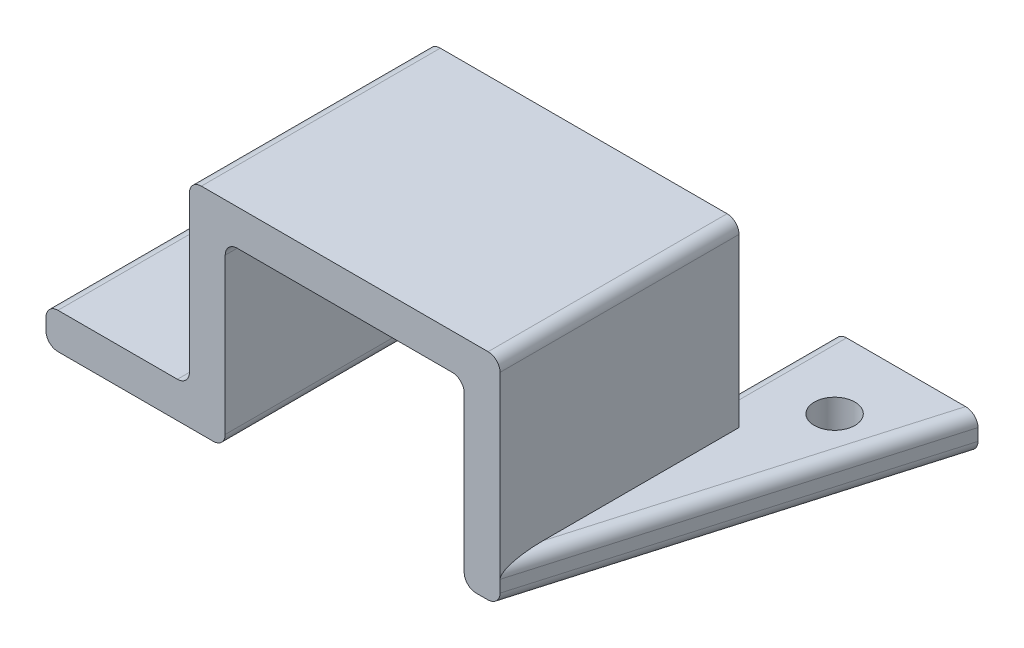
ISO-10303-21;
HEADER;
FILE_DESCRIPTION(('STEP AP214'),'2;1');
FILE_NAME('part.step','',(''),(''),'','','');
FILE_SCHEMA(('AUTOMOTIVE_DESIGN { 1 0 10303 214 1 1 1 1 }'));
ENDSEC;
DATA;
#1=APPLICATION_CONTEXT('core data for automotive mechanical design processes');
#2=APPLICATION_PROTOCOL_DEFINITION('international standard','automotive_design',2000,#1);
#3=PRODUCT_CONTEXT('',#1,'mechanical');
#4=PRODUCT('Part','Part','',(#3));
#5=PRODUCT_RELATED_PRODUCT_CATEGORY('part','',(#4));
#6=PRODUCT_DEFINITION_FORMATION('','',#4);
#7=PRODUCT_DEFINITION_CONTEXT('part definition',#1,'design');
#8=PRODUCT_DEFINITION('design','',#6,#7);
#9=PRODUCT_DEFINITION_SHAPE('','',#8);
#10=(LENGTH_UNIT() NAMED_UNIT(*) SI_UNIT(.MILLI.,.METRE.));
#11=(NAMED_UNIT(*) PLANE_ANGLE_UNIT() SI_UNIT($,.RADIAN.));
#12=(NAMED_UNIT(*) SI_UNIT($,.STERADIAN.) SOLID_ANGLE_UNIT());
#13=UNCERTAINTY_MEASURE_WITH_UNIT(LENGTH_MEASURE(1.E-05),#10,'distance_accuracy_value','');
#14=(GEOMETRIC_REPRESENTATION_CONTEXT(3) GLOBAL_UNCERTAINTY_ASSIGNED_CONTEXT((#13)) GLOBAL_UNIT_ASSIGNED_CONTEXT((#10,
#11,#12)) REPRESENTATION_CONTEXT('',''));
#15=CARTESIAN_POINT('',(0.,0.,0.));
#16=DIRECTION('',(0.,0.,1.));
#17=DIRECTION('',(1.,0.,0.));
#18=AXIS2_PLACEMENT_3D('',#15,#16,#17);
#19=CARTESIAN_POINT('',(0.,18.,20.));
#20=DIRECTION('',(1.,0.,0.));
#21=DIRECTION('',(0.,1.,0.));
#22=AXIS2_PLACEMENT_3D('',#19,#20,#21);
#23=PLANE('',#22);
#24=DIRECTION('',(0.,-1.,0.));
#25=VECTOR('',#24,1.);
#26=CARTESIAN_POINT('',(0.,18.,0.));
#27=LINE('',#26,#25);
#28=CARTESIAN_POINT('',(0.,17.,0.));
#29=VERTEX_POINT('',#28);
#30=CARTESIAN_POINT('',(0.,4.,0.));
#31=VERTEX_POINT('',#30);
#32=EDGE_CURVE('E243',#29,#31,#27,.T.);
#33=ORIENTED_EDGE('',*,*,#32,.T.);
#34=DIRECTION('',(0.,0.,-1.));
#35=VECTOR('',#34,1.);
#36=CARTESIAN_POINT('',(0.,4.,20.));
#37=LINE('',#36,#35);
#38=CARTESIAN_POINT('',(0.,4.,20.));
#39=VERTEX_POINT('',#38);
#40=EDGE_CURVE('E338',#31,#39,#37,.F.);
#41=ORIENTED_EDGE('',*,*,#40,.T.);
#42=DIRECTION('',(0.,-1.,0.));
#43=VECTOR('',#42,1.);
#44=CARTESIAN_POINT('',(0.,18.,20.));
#45=LINE('',#44,#43);
#46=CARTESIAN_POINT('',(0.,17.,20.));
#47=VERTEX_POINT('',#46);
#48=EDGE_CURVE('E257',#47,#39,#45,.T.);
#49=ORIENTED_EDGE('',*,*,#48,.F.);
#50=DIRECTION('',(0.,0.,-1.));
#51=VECTOR('',#50,1.);
#52=CARTESIAN_POINT('',(0.,17.,20.));
#53=LINE('',#52,#51);
#54=EDGE_CURVE('E334',#47,#29,#53,.T.);
#55=ORIENTED_EDGE('',*,*,#54,.T.);
#56=EDGE_LOOP('',(#33,#41,#49,#55));
#57=FACE_BOUND('',#56,.T.);
#58=ADVANCED_FACE('F45',(#57),#23,.F.);
#59=CARTESIAN_POINT('',(0.,0.,20.));
#60=DIRECTION('',(0.,1.,0.));
#61=DIRECTION('',(0.,0.,1.));
#62=AXIS2_PLACEMENT_3D('',#59,#60,#61);
#63=PLANE('',#62);
#64=CARTESIAN_POINT('',(-6.,0.,10.));
#65=DIRECTION('',(0.,1.,0.));
#66=DIRECTION('',(0.,0.,1.));
#67=AXIS2_PLACEMENT_3D('',#64,#65,#66);
#68=CIRCLE('',#67,1.69999999999999);
#69=CARTESIAN_POINT('',(-6.,0.,11.7));
#70=VERTEX_POINT('',#69);
#71=EDGE_CURVE('E511',#70,#70,#68,.T.);
#72=ORIENTED_EDGE('',*,*,#71,.T.);
#73=EDGE_LOOP('',(#72));
#74=FACE_BOUND('',#73,.T.);
#75=DIRECTION('',(1.,0.,0.));
#76=VECTOR('',#75,1.);
#77=CARTESIAN_POINT('',(0.,0.,0.));
#78=LINE('',#77,#76);
#79=CARTESIAN_POINT('',(-11.,0.,0.));
#80=VERTEX_POINT('',#79);
#81=CARTESIAN_POINT('',(2.,0.,0.));
#82=VERTEX_POINT('',#81);
#83=EDGE_CURVE('E419',#80,#82,#78,.T.);
#84=ORIENTED_EDGE('',*,*,#83,.T.);
#85=DIRECTION('',(0.,0.,-1.));
#86=VECTOR('',#85,1.);
#87=CARTESIAN_POINT('',(2.,0.,20.));
#88=LINE('',#87,#86);
#89=CARTESIAN_POINT('',(2.,0.,20.));
#90=VERTEX_POINT('',#89);
#91=EDGE_CURVE('E295',#82,#90,#88,.F.);
#92=ORIENTED_EDGE('',*,*,#91,.T.);
#93=DIRECTION('',(1.,0.,0.));
#94=VECTOR('',#93,1.);
#95=CARTESIAN_POINT('',(0.,0.,20.));
#96=LINE('',#95,#94);
#97=CARTESIAN_POINT('',(-11.,0.,20.));
#98=VERTEX_POINT('',#97);
#99=EDGE_CURVE('E252',#98,#90,#96,.T.);
#100=ORIENTED_EDGE('',*,*,#99,.F.);
#101=DIRECTION('',(0.,0.,1.));
#102=VECTOR('',#101,1.);
#103=CARTESIAN_POINT('',(-11.,0.,20.));
#104=LINE('',#103,#102);
#105=EDGE_CURVE('E292',#98,#80,#104,.F.);
#106=ORIENTED_EDGE('',*,*,#105,.T.);
#107=EDGE_LOOP('',(#84,#92,#100,#106));
#108=FACE_BOUND('',#107,.T.);
#109=ADVANCED_FACE('F543',(#74,#108),#63,.F.);
#110=CARTESIAN_POINT('',(3.,0.,20.));
#111=DIRECTION('',(-1.,0.,0.));
#112=DIRECTION('',(0.,0.,1.));
#113=AXIS2_PLACEMENT_3D('',#110,#111,#112);
#114=PLANE('',#113);
#115=DIRECTION('',(0.,1.,0.));
#116=VECTOR('',#115,1.);
#117=CARTESIAN_POINT('',(3.,0.,0.));
#118=LINE('',#117,#116);
#119=CARTESIAN_POINT('',(3.,1.,0.));
#120=VERTEX_POINT('',#119);
#121=CARTESIAN_POINT('',(3.,14.,0.));
#122=VERTEX_POINT('',#121);
#123=EDGE_CURVE('E457',#120,#122,#118,.T.);
#124=ORIENTED_EDGE('',*,*,#123,.T.);
#125=DIRECTION('',(0.,0.,-1.));
#126=VECTOR('',#125,1.);
#127=CARTESIAN_POINT('',(3.,14.,20.));
#128=LINE('',#127,#126);
#129=CARTESIAN_POINT('',(3.,14.,20.));
#130=VERTEX_POINT('',#129);
#131=EDGE_CURVE('E265',#122,#130,#128,.F.);
#132=ORIENTED_EDGE('',*,*,#131,.T.);
#133=DIRECTION('',(0.,1.,0.));
#134=VECTOR('',#133,1.);
#135=CARTESIAN_POINT('',(3.,0.,20.));
#136=LINE('',#135,#134);
#137=CARTESIAN_POINT('',(3.,1.,20.));
#138=VERTEX_POINT('',#137);
#139=EDGE_CURVE('E426',#138,#130,#136,.T.);
#140=ORIENTED_EDGE('',*,*,#139,.F.);
#141=DIRECTION('',(0.,0.,-1.));
#142=VECTOR('',#141,1.);
#143=CARTESIAN_POINT('',(3.,1.,20.));
#144=LINE('',#143,#142);
#145=EDGE_CURVE('E261',#138,#120,#144,.T.);
#146=ORIENTED_EDGE('',*,*,#145,.T.);
#147=EDGE_LOOP('',(#124,#132,#140,#146));
#148=FACE_BOUND('',#147,.T.);
#149=ADVANCED_FACE('F550',(#148),#114,.F.);
#150=CARTESIAN_POINT('',(3.,15.,20.));
#151=DIRECTION('',(0.,1.,0.));
#152=DIRECTION('',(0.,0.,1.));
#153=AXIS2_PLACEMENT_3D('',#150,#151,#152);
#154=PLANE('',#153);
#155=DIRECTION('',(1.,0.,0.));
#156=VECTOR('',#155,1.);
#157=CARTESIAN_POINT('',(3.,15.,20.));
#158=LINE('',#157,#156);
#159=CARTESIAN_POINT('',(4.,15.,20.));
#160=VERTEX_POINT('',#159);
#161=CARTESIAN_POINT('',(22.,15.,20.));
#162=VERTEX_POINT('',#161);
#163=EDGE_CURVE('E430',#160,#162,#158,.T.);
#164=ORIENTED_EDGE('',*,*,#163,.F.);
#165=DIRECTION('',(0.,0.,-1.));
#166=VECTOR('',#165,1.);
#167=CARTESIAN_POINT('',(4.,15.,0.));
#168=LINE('',#167,#166);
#169=CARTESIAN_POINT('',(4.,15.,0.));
#170=VERTEX_POINT('',#169);
#171=EDGE_CURVE('E256',#160,#170,#168,.T.);
#172=ORIENTED_EDGE('',*,*,#171,.T.);
#173=DIRECTION('',(1.,0.,0.));
#174=VECTOR('',#173,1.);
#175=CARTESIAN_POINT('',(3.,15.,0.));
#176=LINE('',#175,#174);
#177=CARTESIAN_POINT('',(22.,15.,0.));
#178=VERTEX_POINT('',#177);
#179=EDGE_CURVE('E245',#170,#178,#176,.T.);
#180=ORIENTED_EDGE('',*,*,#179,.T.);
#181=DIRECTION('',(0.,0.,-1.));
#182=VECTOR('',#181,1.);
#183=CARTESIAN_POINT('',(22.,15.,20.));
#184=LINE('',#183,#182);
#185=EDGE_CURVE('E253',#178,#162,#184,.F.);
#186=ORIENTED_EDGE('',*,*,#185,.T.);
#187=EDGE_LOOP('',(#164,#172,#180,#186));
#188=FACE_BOUND('',#187,.T.);
#189=ADVANCED_FACE('F466',(#188),#154,.F.);
#190=CARTESIAN_POINT('',(23.,15.,20.));
#191=DIRECTION('',(1.,0.,0.));
#192=DIRECTION('',(0.,0.,-1.));
#193=AXIS2_PLACEMENT_3D('',#190,#191,#192);
#194=PLANE('',#193);
#195=DIRECTION('',(0.,-1.,0.));
#196=VECTOR('',#195,1.);
#197=CARTESIAN_POINT('',(23.,15.,20.));
#198=LINE('',#197,#196);
#199=CARTESIAN_POINT('',(23.,14.,20.));
#200=VERTEX_POINT('',#199);
#201=CARTESIAN_POINT('',(23.,1.,20.));
#202=VERTEX_POINT('',#201);
#203=EDGE_CURVE('E434',#200,#202,#198,.T.);
#204=ORIENTED_EDGE('',*,*,#203,.F.);
#205=DIRECTION('',(0.,0.,-1.));
#206=VECTOR('',#205,1.);
#207=CARTESIAN_POINT('',(23.,14.,0.));
#208=LINE('',#207,#206);
#209=CARTESIAN_POINT('',(23.,14.,0.));
#210=VERTEX_POINT('',#209);
#211=EDGE_CURVE('E274',#200,#210,#208,.T.);
#212=ORIENTED_EDGE('',*,*,#211,.T.);
#213=DIRECTION('',(0.,-1.,0.));
#214=VECTOR('',#213,1.);
#215=CARTESIAN_POINT('',(23.,15.,0.));
#216=LINE('',#215,#214);
#217=CARTESIAN_POINT('',(23.,2.,0.));
#218=VERTEX_POINT('',#217);
#219=EDGE_CURVE('E238',#210,#218,#216,.T.);
#220=ORIENTED_EDGE('',*,*,#219,.T.);
#221=DIRECTION('',(0.,0.,1.));
#222=VECTOR('',#221,1.);
#223=CARTESIAN_POINT('',(23.,2.,-11.));
#224=LINE('',#223,#222);
#225=CARTESIAN_POINT('',(23.,2.,-11.));
#226=VERTEX_POINT('',#225);
#227=EDGE_CURVE('E271',#218,#226,#224,.F.);
#228=ORIENTED_EDGE('',*,*,#227,.T.);
#229=DIRECTION('',(0.,-1.,0.));
#230=VECTOR('',#229,1.);
#231=CARTESIAN_POINT('',(23.,3.,-11.));
#232=LINE('',#231,#230);
#233=CARTESIAN_POINT('',(23.,1.,-11.));
#234=VERTEX_POINT('',#233);
#235=EDGE_CURVE('E219',#226,#234,#232,.T.);
#236=ORIENTED_EDGE('',*,*,#235,.T.);
#237=DIRECTION('',(0.,0.,-1.));
#238=VECTOR('',#237,1.);
#239=CARTESIAN_POINT('',(23.,1.,20.));
#240=LINE('',#239,#238);
#241=EDGE_CURVE('E268',#234,#202,#240,.F.);
#242=ORIENTED_EDGE('',*,*,#241,.T.);
#243=EDGE_LOOP('',(#204,#212,#220,#228,#236,#242));
#244=FACE_BOUND('',#243,.T.);
#245=ADVANCED_FACE('F408',(#244),#194,.F.);
#246=CARTESIAN_POINT('',(23.,0.,20.));
#247=DIRECTION('',(0.,1.,0.));
#248=DIRECTION('',(0.,0.,1.));
#249=AXIS2_PLACEMENT_3D('',#246,#247,#248);
#250=PLANE('',#249);
#251=CARTESIAN_POINT('',(29.,0.,-5.));
#252=DIRECTION('',(0.,1.,0.));
#253=DIRECTION('',(0.,0.,1.));
#254=AXIS2_PLACEMENT_3D('',#251,#252,#253);
#255=CIRCLE('',#254,1.7);
#256=CARTESIAN_POINT('',(29.,0.,-3.3));
#257=VERTEX_POINT('',#256);
#258=EDGE_CURVE('E519',#257,#257,#255,.T.);
#259=ORIENTED_EDGE('',*,*,#258,.T.);
#260=EDGE_LOOP('',(#259));
#261=FACE_BOUND('',#260,.T.);
#262=DIRECTION('',(1.,0.,0.));
#263=VECTOR('',#262,1.);
#264=CARTESIAN_POINT('',(23.,0.,20.));
#265=LINE('',#264,#263);
#266=CARTESIAN_POINT('',(24.,0.,20.));
#267=VERTEX_POINT('',#266);
#268=CARTESIAN_POINT('',(24.9587088779633,0.,20.));
#269=VERTEX_POINT('',#268);
#270=EDGE_CURVE('E438',#267,#269,#265,.T.);
#271=ORIENTED_EDGE('',*,*,#270,.F.);
#272=DIRECTION('',(0.,0.,-1.));
#273=VECTOR('',#272,1.);
#274=CARTESIAN_POINT('',(24.,0.,20.));
#275=LINE('',#274,#273);
#276=CARTESIAN_POINT('',(24.,0.,-11.));
#277=VERTEX_POINT('',#276);
#278=EDGE_CURVE('E360',#267,#277,#275,.T.);
#279=ORIENTED_EDGE('',*,*,#278,.T.);
#280=DIRECTION('',(-1.,0.,0.));
#281=VECTOR('',#280,1.);
#282=CARTESIAN_POINT('',(35.,0.,-11.));
#283=LINE('',#282,#281);
#284=CARTESIAN_POINT('',(33.9587088779633,0.,-11.));
#285=VERTEX_POINT('',#284);
#286=EDGE_CURVE('E230',#285,#277,#283,.T.);
#287=ORIENTED_EDGE('',*,*,#286,.F.);
#288=DIRECTION('',(0.278810194863956,0.,-0.960346226753624));
#289=VECTOR('',#288,1.);
#290=CARTESIAN_POINT('',(24.8064483989661,0.,20.5244527609902));
#291=LINE('',#290,#289);
#292=EDGE_CURVE('E357',#285,#269,#291,.F.);
#293=ORIENTED_EDGE('',*,*,#292,.T.);
#294=EDGE_LOOP('',(#271,#279,#287,#293));
#295=FACE_BOUND('',#294,.T.);
#296=ADVANCED_FACE('F481',(#261,#295),#250,.F.);
#297=CARTESIAN_POINT('',(26.,0.,20.));
#298=DIRECTION('',(-1.,0.,0.));
#299=DIRECTION('',(0.,0.,1.));
#300=AXIS2_PLACEMENT_3D('',#297,#298,#299);
#301=PLANE('',#300);
#302=DIRECTION('',(0.,1.,0.));
#303=VECTOR('',#302,1.);
#304=CARTESIAN_POINT('',(26.,0.,0.));
#305=LINE('',#304,#303);
#306=CARTESIAN_POINT('',(26.,3.,0.));
#307=VERTEX_POINT('',#306);
#308=CARTESIAN_POINT('',(26.,17.,0.));
#309=VERTEX_POINT('',#308);
#310=EDGE_CURVE('E225',#307,#309,#305,.T.);
#311=ORIENTED_EDGE('',*,*,#310,.T.);
#312=DIRECTION('',(0.,0.,-1.));
#313=VECTOR('',#312,1.);
#314=CARTESIAN_POINT('',(26.,17.,20.));
#315=LINE('',#314,#313);
#316=CARTESIAN_POINT('',(26.,17.,20.));
#317=VERTEX_POINT('',#316);
#318=EDGE_CURVE('E378',#309,#317,#315,.F.);
#319=ORIENTED_EDGE('',*,*,#318,.T.);
#320=DIRECTION('',(0.,1.,0.));
#321=VECTOR('',#320,1.);
#322=CARTESIAN_POINT('',(26.,0.,20.));
#323=LINE('',#322,#321);
#324=CARTESIAN_POINT('',(26.,2.,20.));
#325=VERTEX_POINT('',#324);
#326=EDGE_CURVE('E442',#325,#317,#323,.T.);
#327=ORIENTED_EDGE('',*,*,#326,.F.);
#328=CARTESIAN_POINT('',(26.,2.,16.4133305796513));
#329=DIRECTION('',(-1.,0.,0.));
#330=DIRECTION('',(0.,0.,1.));
#331=AXIS2_PLACEMENT_3D('',#328,#329,#330);
#332=ELLIPSE('',#331,3.58666942034866,1.);
#333=CARTESIAN_POINT('',(26.,3.,16.4133305796513));
#334=VERTEX_POINT('',#333);
#335=EDGE_CURVE('E11',#325,#334,#332,.T.);
#336=ORIENTED_EDGE('',*,*,#335,.T.);
#337=DIRECTION('',(0.,0.,1.));
#338=VECTOR('',#337,1.);
#339=CARTESIAN_POINT('',(26.,3.,20.));
#340=LINE('',#339,#338);
#341=EDGE_CURVE('E211',#307,#334,#340,.T.);
#342=ORIENTED_EDGE('',*,*,#341,.F.);
#343=EDGE_LOOP('',(#311,#319,#327,#336,#342));
#344=FACE_BOUND('',#343,.T.);
#345=ADVANCED_FACE('F224',(#344),#301,.F.);
#346=CARTESIAN_POINT('',(26.,18.,20.));
#347=DIRECTION('',(0.,-1.,0.));
#348=DIRECTION('',(1.,0.,0.));
#349=AXIS2_PLACEMENT_3D('',#346,#347,#348);
#350=PLANE('',#349);
#351=DIRECTION('',(-1.,0.,0.));
#352=VECTOR('',#351,1.);
#353=CARTESIAN_POINT('',(26.,18.,0.));
#354=LINE('',#353,#352);
#355=CARTESIAN_POINT('',(25.,18.,0.));
#356=VERTEX_POINT('',#355);
#357=CARTESIAN_POINT('',(1.,18.,0.));
#358=VERTEX_POINT('',#357);
#359=EDGE_CURVE('E237',#356,#358,#354,.T.);
#360=ORIENTED_EDGE('',*,*,#359,.T.);
#361=DIRECTION('',(0.,0.,-1.));
#362=VECTOR('',#361,1.);
#363=CARTESIAN_POINT('',(1.,18.,20.));
#364=LINE('',#363,#362);
#365=CARTESIAN_POINT('',(1.,18.,20.));
#366=VERTEX_POINT('',#365);
#367=EDGE_CURVE('E368',#358,#366,#364,.F.);
#368=ORIENTED_EDGE('',*,*,#367,.T.);
#369=DIRECTION('',(-1.,0.,0.));
#370=VECTOR('',#369,1.);
#371=CARTESIAN_POINT('',(26.,18.,20.));
#372=LINE('',#371,#370);
#373=CARTESIAN_POINT('',(25.,18.,20.));
#374=VERTEX_POINT('',#373);
#375=EDGE_CURVE('E447',#374,#366,#372,.T.);
#376=ORIENTED_EDGE('',*,*,#375,.F.);
#377=DIRECTION('',(0.,0.,-1.));
#378=VECTOR('',#377,1.);
#379=CARTESIAN_POINT('',(25.,18.,20.));
#380=LINE('',#379,#378);
#381=EDGE_CURVE('E364',#374,#356,#380,.T.);
#382=ORIENTED_EDGE('',*,*,#381,.T.);
#383=EDGE_LOOP('',(#360,#368,#376,#382));
#384=FACE_BOUND('',#383,.T.);
#385=ADVANCED_FACE('F556',(#384),#350,.F.);
#386=CARTESIAN_POINT('',(0.,0.,20.));
#387=DIRECTION('',(0.,0.,1.));
#388=DIRECTION('',(1.,0.,0.));
#389=AXIS2_PLACEMENT_3D('',#386,#387,#388);
#390=PLANE('',#389);
#391=ORIENTED_EDGE('',*,*,#99,.T.);
#392=CARTESIAN_POINT('',(2.,1.,20.));
#393=DIRECTION('',(0.,0.,1.));
#394=DIRECTION('',(1.,0.,0.));
#395=AXIS2_PLACEMENT_3D('',#392,#393,#394);
#396=CIRCLE('',#395,1.);
#397=EDGE_CURVE('E316',#90,#138,#396,.T.);
#398=ORIENTED_EDGE('',*,*,#397,.T.);
#399=ORIENTED_EDGE('',*,*,#139,.T.);
#400=CARTESIAN_POINT('',(4.,14.,20.));
#401=DIRECTION('',(0.,0.,1.));
#402=DIRECTION('',(1.,0.,0.));
#403=AXIS2_PLACEMENT_3D('',#400,#401,#402);
#404=CIRCLE('',#403,1.);
#405=EDGE_CURVE('E384',#130,#160,#404,.F.);
#406=ORIENTED_EDGE('',*,*,#405,.T.);
#407=ORIENTED_EDGE('',*,*,#163,.T.);
#408=CARTESIAN_POINT('',(22.,14.,20.));
#409=DIRECTION('',(0.,0.,1.));
#410=DIRECTION('',(1.,0.,0.));
#411=AXIS2_PLACEMENT_3D('',#408,#409,#410);
#412=CIRCLE('',#411,1.);
#413=EDGE_CURVE('E390',#162,#200,#412,.F.);
#414=ORIENTED_EDGE('',*,*,#413,.T.);
#415=ORIENTED_EDGE('',*,*,#203,.T.);
#416=CARTESIAN_POINT('',(24.,1.,20.));
#417=DIRECTION('',(0.,0.,1.));
#418=DIRECTION('',(1.,0.,0.));
#419=AXIS2_PLACEMENT_3D('',#416,#417,#418);
#420=CIRCLE('',#419,1.);
#421=EDGE_CURVE('E307',#202,#267,#420,.T.);
#422=ORIENTED_EDGE('',*,*,#421,.T.);
#423=ORIENTED_EDGE('',*,*,#270,.T.);
#424=CARTESIAN_POINT('',(24.9587088779633,1.,20.));
#425=DIRECTION('',(0.,0.,1.));
#426=DIRECTION('',(1.,0.,0.));
#427=AXIS2_PLACEMENT_3D('',#424,#425,#426);
#428=ELLIPSE('',#427,1.04129112203671,1.);
#429=CARTESIAN_POINT('',(26.,1.,20.));
#430=VERTEX_POINT('',#429);
#431=EDGE_CURVE('E301',#269,#430,#428,.T.);
#432=ORIENTED_EDGE('',*,*,#431,.T.);
#433=EDGE_CURVE('E443',#430,#325,#323,.T.);
#434=ORIENTED_EDGE('',*,*,#433,.T.);
#435=ORIENTED_EDGE('',*,*,#326,.T.);
#436=CARTESIAN_POINT('',(25.,17.,20.));
#437=DIRECTION('',(0.,0.,1.));
#438=DIRECTION('',(1.,0.,0.));
#439=AXIS2_PLACEMENT_3D('',#436,#437,#438);
#440=CIRCLE('',#439,1.);
#441=EDGE_CURVE('E298',#317,#374,#440,.T.);
#442=ORIENTED_EDGE('',*,*,#441,.T.);
#443=ORIENTED_EDGE('',*,*,#375,.T.);
#444=CARTESIAN_POINT('',(1.,17.,20.));
#445=DIRECTION('',(0.,0.,1.));
#446=DIRECTION('',(1.,0.,0.));
#447=AXIS2_PLACEMENT_3D('',#444,#445,#446);
#448=CIRCLE('',#447,1.);
#449=EDGE_CURVE('E304',#366,#47,#448,.T.);
#450=ORIENTED_EDGE('',*,*,#449,.T.);
#451=ORIENTED_EDGE('',*,*,#48,.T.);
#452=CARTESIAN_POINT('',(-1.,4.,20.));
#453=DIRECTION('',(0.,0.,1.));
#454=DIRECTION('',(1.,0.,0.));
#455=AXIS2_PLACEMENT_3D('',#452,#453,#454);
#456=CIRCLE('',#455,1.);
#457=CARTESIAN_POINT('',(-1.,3.,20.));
#458=VERTEX_POINT('',#457);
#459=EDGE_CURVE('E396',#39,#458,#456,.F.);
#460=ORIENTED_EDGE('',*,*,#459,.T.);
#461=DIRECTION('',(1.,0.,0.));
#462=VECTOR('',#461,1.);
#463=CARTESIAN_POINT('',(0.,3.,20.));
#464=LINE('',#463,#462);
#465=CARTESIAN_POINT('',(-11.,3.,20.));
#466=VERTEX_POINT('',#465);
#467=EDGE_CURVE('E499',#466,#458,#464,.T.);
#468=ORIENTED_EDGE('',*,*,#467,.F.);
#469=CARTESIAN_POINT('',(-11.,2.,20.));
#470=DIRECTION('',(0.,0.,1.));
#471=DIRECTION('',(1.,0.,0.));
#472=AXIS2_PLACEMENT_3D('',#469,#470,#471);
#473=CIRCLE('',#472,1.);
#474=CARTESIAN_POINT('',(-12.,2.,20.));
#475=VERTEX_POINT('',#474);
#476=EDGE_CURVE('E310',#466,#475,#473,.T.);
#477=ORIENTED_EDGE('',*,*,#476,.T.);
#478=DIRECTION('',(0.,-1.,0.));
#479=VECTOR('',#478,1.);
#480=CARTESIAN_POINT('',(-12.,3.,20.));
#481=LINE('',#480,#479);
#482=CARTESIAN_POINT('',(-12.,1.,20.));
#483=VERTEX_POINT('',#482);
#484=EDGE_CURVE('E503',#475,#483,#481,.T.);
#485=ORIENTED_EDGE('',*,*,#484,.T.);
#486=CARTESIAN_POINT('',(-11.,1.,20.));
#487=DIRECTION('',(0.,0.,1.));
#488=DIRECTION('',(1.,0.,0.));
#489=AXIS2_PLACEMENT_3D('',#486,#487,#488);
#490=CIRCLE('',#489,1.);
#491=EDGE_CURVE('E313',#483,#98,#490,.T.);
#492=ORIENTED_EDGE('',*,*,#491,.T.);
#493=EDGE_LOOP('',(#391,#398,#399,#406,#407,#414,#415,#422,#423,#432,#434,#435,#442,#443,#450,
#451,#460,#468,#477,#485,#492));
#494=FACE_BOUND('',#493,.T.);
#495=ADVANCED_FACE('F473',(#494),#390,.T.);
#496=CARTESIAN_POINT('',(0.,0.,0.));
#497=DIRECTION('',(0.,0.,1.));
#498=DIRECTION('',(1.,0.,0.));
#499=AXIS2_PLACEMENT_3D('',#496,#497,#498);
#500=PLANE('',#499);
#501=ORIENTED_EDGE('',*,*,#123,.F.);
#502=CARTESIAN_POINT('',(2.,1.,0.));
#503=DIRECTION('',(0.,0.,1.));
#504=DIRECTION('',(1.,0.,0.));
#505=AXIS2_PLACEMENT_3D('',#502,#503,#504);
#506=CIRCLE('',#505,1.);
#507=EDGE_CURVE('E289',#120,#82,#506,.F.);
#508=ORIENTED_EDGE('',*,*,#507,.T.);
#509=ORIENTED_EDGE('',*,*,#83,.F.);
#510=CARTESIAN_POINT('',(-11.,1.,0.));
#511=DIRECTION('',(0.,0.,1.));
#512=DIRECTION('',(1.,0.,0.));
#513=AXIS2_PLACEMENT_3D('',#510,#511,#512);
#514=CIRCLE('',#513,1.);
#515=CARTESIAN_POINT('',(-12.,1.,0.));
#516=VERTEX_POINT('',#515);
#517=EDGE_CURVE('E286',#80,#516,#514,.F.);
#518=ORIENTED_EDGE('',*,*,#517,.T.);
#519=DIRECTION('',(0.,-1.,0.));
#520=VECTOR('',#519,1.);
#521=CARTESIAN_POINT('',(-12.,3.,0.));
#522=LINE('',#521,#520);
#523=CARTESIAN_POINT('',(-12.,2.,0.));
#524=VERTEX_POINT('',#523);
#525=EDGE_CURVE('E507',#524,#516,#522,.T.);
#526=ORIENTED_EDGE('',*,*,#525,.F.);
#527=CARTESIAN_POINT('',(-11.,2.,0.));
#528=DIRECTION('',(0.,0.,1.));
#529=DIRECTION('',(1.,0.,0.));
#530=AXIS2_PLACEMENT_3D('',#527,#528,#529);
#531=CIRCLE('',#530,1.);
#532=CARTESIAN_POINT('',(-11.,3.,0.));
#533=VERTEX_POINT('',#532);
#534=EDGE_CURVE('E283',#524,#533,#531,.F.);
#535=ORIENTED_EDGE('',*,*,#534,.T.);
#536=DIRECTION('',(-1.,0.,0.));
#537=VECTOR('',#536,1.);
#538=CARTESIAN_POINT('',(0.,3.,0.));
#539=LINE('',#538,#537);
#540=CARTESIAN_POINT('',(-1.,3.,0.));
#541=VERTEX_POINT('',#540);
#542=EDGE_CURVE('E495',#541,#533,#539,.T.);
#543=ORIENTED_EDGE('',*,*,#542,.F.);
#544=CARTESIAN_POINT('',(-1.,4.,0.));
#545=DIRECTION('',(0.,0.,1.));
#546=DIRECTION('',(1.,0.,0.));
#547=AXIS2_PLACEMENT_3D('',#544,#545,#546);
#548=CIRCLE('',#547,1.);
#549=EDGE_CURVE('E393',#541,#31,#548,.T.);
#550=ORIENTED_EDGE('',*,*,#549,.T.);
#551=ORIENTED_EDGE('',*,*,#32,.F.);
#552=CARTESIAN_POINT('',(1.,17.,0.));
#553=DIRECTION('',(0.,0.,1.));
#554=DIRECTION('',(1.,0.,0.));
#555=AXIS2_PLACEMENT_3D('',#552,#553,#554);
#556=CIRCLE('',#555,1.);
#557=EDGE_CURVE('E280',#29,#358,#556,.F.);
#558=ORIENTED_EDGE('',*,*,#557,.T.);
#559=ORIENTED_EDGE('',*,*,#359,.F.);
#560=CARTESIAN_POINT('',(25.,17.,0.));
#561=DIRECTION('',(0.,0.,1.));
#562=DIRECTION('',(1.,0.,0.));
#563=AXIS2_PLACEMENT_3D('',#560,#561,#562);
#564=CIRCLE('',#563,1.);
#565=EDGE_CURVE('E235',#356,#309,#564,.F.);
#566=ORIENTED_EDGE('',*,*,#565,.T.);
#567=ORIENTED_EDGE('',*,*,#310,.F.);
#568=DIRECTION('',(1.,0.,0.));
#569=VECTOR('',#568,1.);
#570=CARTESIAN_POINT('',(26.,3.,0.));
#571=LINE('',#570,#569);
#572=CARTESIAN_POINT('',(24.,3.,0.));
#573=VERTEX_POINT('',#572);
#574=EDGE_CURVE('E206',#573,#307,#571,.T.);
#575=ORIENTED_EDGE('',*,*,#574,.F.);
#576=CARTESIAN_POINT('',(24.,2.,0.));
#577=DIRECTION('',(0.,0.,1.));
#578=DIRECTION('',(1.,0.,0.));
#579=AXIS2_PLACEMENT_3D('',#576,#577,#578);
#580=CIRCLE('',#579,1.);
#581=EDGE_CURVE('E55',#573,#218,#580,.T.);
#582=ORIENTED_EDGE('',*,*,#581,.T.);
#583=ORIENTED_EDGE('',*,*,#219,.F.);
#584=CARTESIAN_POINT('',(22.,14.,0.));
#585=DIRECTION('',(0.,0.,1.));
#586=DIRECTION('',(1.,0.,0.));
#587=AXIS2_PLACEMENT_3D('',#584,#585,#586);
#588=CIRCLE('',#587,1.);
#589=EDGE_CURVE('E387',#210,#178,#588,.T.);
#590=ORIENTED_EDGE('',*,*,#589,.T.);
#591=ORIENTED_EDGE('',*,*,#179,.F.);
#592=CARTESIAN_POINT('',(4.,14.,0.));
#593=DIRECTION('',(0.,0.,1.));
#594=DIRECTION('',(1.,0.,0.));
#595=AXIS2_PLACEMENT_3D('',#592,#593,#594);
#596=CIRCLE('',#595,1.);
#597=EDGE_CURVE('E381',#170,#122,#596,.T.);
#598=ORIENTED_EDGE('',*,*,#597,.T.);
#599=EDGE_LOOP('',(#501,#508,#509,#518,#526,#535,#543,#550,#551,#558,#559,#566,#567,#575,#582,
#583,#590,#591,#598));
#600=FACE_BOUND('',#599,.T.);
#601=ADVANCED_FACE('F233',(#600),#500,.F.);
#602=CARTESIAN_POINT('',(26.,3.,20.));
#603=DIRECTION('',(-0.960346226753624,0.,-0.278810194863956));
#604=DIRECTION('',(-0.278810194863956,0.,0.960346226753624));
#605=AXIS2_PLACEMENT_3D('',#602,#603,#604);
#606=PLANE('',#605);
#607=DIRECTION('',(0.,-1.,0.));
#608=VECTOR('',#607,1.);
#609=CARTESIAN_POINT('',(35.,3.,-11.));
#610=LINE('',#609,#608);
#611=CARTESIAN_POINT('',(35.,2.,-11.));
#612=VERTEX_POINT('',#611);
#613=CARTESIAN_POINT('',(35.,1.,-11.));
#614=VERTEX_POINT('',#613);
#615=EDGE_CURVE('E415',#612,#614,#610,.T.);
#616=ORIENTED_EDGE('',*,*,#615,.F.);
#617=DIRECTION('',(0.278810194863956,0.,-0.960346226753624));
#618=VECTOR('',#617,1.);
#619=CARTESIAN_POINT('',(26.,2.,20.));
#620=LINE('',#619,#618);
#621=EDGE_CURVE('E374',#612,#325,#620,.F.);
#622=ORIENTED_EDGE('',*,*,#621,.T.);
#623=ORIENTED_EDGE('',*,*,#433,.F.);
#624=DIRECTION('',(0.278810194863956,0.,-0.960346226753624));
#625=VECTOR('',#624,1.);
#626=CARTESIAN_POINT('',(26.,1.,20.));
#627=LINE('',#626,#625);
#628=EDGE_CURVE('E371',#430,#614,#627,.T.);
#629=ORIENTED_EDGE('',*,*,#628,.T.);
#630=EDGE_LOOP('',(#616,#622,#623,#629));
#631=FACE_BOUND('',#630,.T.);
#632=ADVANCED_FACE('F488',(#631),#606,.F.);
#633=CARTESIAN_POINT('',(35.,3.,-11.));
#634=DIRECTION('',(0.,0.,1.));
#635=DIRECTION('',(1.,0.,0.));
#636=AXIS2_PLACEMENT_3D('',#633,#634,#635);
#637=PLANE('',#636);
#638=ORIENTED_EDGE('',*,*,#235,.F.);
#639=CARTESIAN_POINT('',(24.,2.,-11.));
#640=DIRECTION('',(0.,0.,1.));
#641=DIRECTION('',(1.,0.,0.));
#642=AXIS2_PLACEMENT_3D('',#639,#640,#641);
#643=CIRCLE('',#642,1.);
#644=CARTESIAN_POINT('',(24.,3.,-11.));
#645=VERTEX_POINT('',#644);
#646=EDGE_CURVE('E354',#226,#645,#643,.F.);
#647=ORIENTED_EDGE('',*,*,#646,.T.);
#648=DIRECTION('',(-1.,0.,0.));
#649=VECTOR('',#648,1.);
#650=CARTESIAN_POINT('',(35.,3.,-11.));
#651=LINE('',#650,#649);
#652=CARTESIAN_POINT('',(33.9587088779633,3.,-11.));
#653=VERTEX_POINT('',#652);
#654=EDGE_CURVE('E220',#653,#645,#651,.T.);
#655=ORIENTED_EDGE('',*,*,#654,.F.);
#656=CARTESIAN_POINT('',(33.9587088779633,2.,-11.));
#657=DIRECTION('',(0.,0.,1.));
#658=DIRECTION('',(-1.,0.,0.));
#659=AXIS2_PLACEMENT_3D('',#656,#657,#658);
#660=ELLIPSE('',#659,1.04129112203671,1.);
#661=EDGE_CURVE('E348',#653,#612,#660,.F.);
#662=ORIENTED_EDGE('',*,*,#661,.T.);
#663=ORIENTED_EDGE('',*,*,#615,.T.);
#664=CARTESIAN_POINT('',(33.9587088779633,1.,-11.));
#665=DIRECTION('',(0.,0.,1.));
#666=DIRECTION('',(1.,0.,0.));
#667=AXIS2_PLACEMENT_3D('',#664,#665,#666);
#668=ELLIPSE('',#667,1.04129112203671,1.);
#669=EDGE_CURVE('E62',#614,#285,#668,.F.);
#670=ORIENTED_EDGE('',*,*,#669,.T.);
#671=ORIENTED_EDGE('',*,*,#286,.T.);
#672=CARTESIAN_POINT('',(24.,1.,-11.));
#673=DIRECTION('',(0.,0.,1.));
#674=DIRECTION('',(1.,0.,0.));
#675=AXIS2_PLACEMENT_3D('',#672,#673,#674);
#676=CIRCLE('',#675,1.);
#677=EDGE_CURVE('E351',#277,#234,#676,.F.);
#678=ORIENTED_EDGE('',*,*,#677,.T.);
#679=EDGE_LOOP('',(#638,#647,#655,#662,#663,#670,#671,#678));
#680=FACE_BOUND('',#679,.T.);
#681=ADVANCED_FACE('F411',(#680),#637,.F.);
#682=CARTESIAN_POINT('',(0.,3.,0.));
#683=DIRECTION('',(0.,1.,0.));
#684=DIRECTION('',(0.,0.,1.));
#685=AXIS2_PLACEMENT_3D('',#682,#683,#684);
#686=PLANE('',#685);
#687=CARTESIAN_POINT('',(29.,3.,-5.));
#688=DIRECTION('',(0.,1.,0.));
#689=DIRECTION('',(0.,0.,1.));
#690=AXIS2_PLACEMENT_3D('',#687,#688,#689);
#691=CIRCLE('',#690,1.69999999999999);
#692=CARTESIAN_POINT('',(29.,3.,-3.30000000000001));
#693=VERTEX_POINT('',#692);
#694=EDGE_CURVE('E523',#693,#693,#691,.T.);
#695=ORIENTED_EDGE('',*,*,#694,.F.);
#696=EDGE_LOOP('',(#695));
#697=FACE_BOUND('',#696,.T.);
#698=ORIENTED_EDGE('',*,*,#654,.T.);
#699=DIRECTION('',(0.,0.,1.));
#700=VECTOR('',#699,1.);
#701=CARTESIAN_POINT('',(24.,3.,0.));
#702=LINE('',#701,#700);
#703=EDGE_CURVE('E214',#645,#573,#702,.T.);
#704=ORIENTED_EDGE('',*,*,#703,.T.);
#705=ORIENTED_EDGE('',*,*,#574,.T.);
#706=ORIENTED_EDGE('',*,*,#341,.T.);
#707=DIRECTION('',(0.278810194863956,0.,-0.960346226753624));
#708=VECTOR('',#707,1.);
#709=CARTESIAN_POINT('',(34.0396537732464,3.,-11.2788101948639));
#710=LINE('',#709,#708);
#711=EDGE_CURVE('E341',#334,#653,#710,.T.);
#712=ORIENTED_EDGE('',*,*,#711,.T.);
#713=EDGE_LOOP('',(#698,#704,#705,#706,#712));
#714=FACE_BOUND('',#713,.T.);
#715=ADVANCED_FACE('F209',(#697,#714),#686,.T.);
#716=CARTESIAN_POINT('',(-12.,3.,20.));
#717=DIRECTION('',(1.,0.,0.));
#718=DIRECTION('',(0.,0.,-1.));
#719=AXIS2_PLACEMENT_3D('',#716,#717,#718);
#720=PLANE('',#719);
#721=ORIENTED_EDGE('',*,*,#525,.T.);
#722=DIRECTION('',(0.,0.,1.));
#723=VECTOR('',#722,1.);
#724=CARTESIAN_POINT('',(-12.,1.,20.));
#725=LINE('',#724,#723);
#726=EDGE_CURVE('E322',#516,#483,#725,.T.);
#727=ORIENTED_EDGE('',*,*,#726,.T.);
#728=ORIENTED_EDGE('',*,*,#484,.F.);
#729=DIRECTION('',(0.,0.,1.));
#730=VECTOR('',#729,1.);
#731=CARTESIAN_POINT('',(-12.,2.,0.));
#732=LINE('',#731,#730);
#733=EDGE_CURVE('E319',#475,#524,#732,.F.);
#734=ORIENTED_EDGE('',*,*,#733,.T.);
#735=EDGE_LOOP('',(#721,#727,#728,#734));
#736=FACE_BOUND('',#735,.T.);
#737=ADVANCED_FACE('F531',(#736),#720,.F.);
#738=CARTESIAN_POINT('',(0.,3.,0.));
#739=DIRECTION('',(0.,1.,0.));
#740=DIRECTION('',(0.,0.,1.));
#741=AXIS2_PLACEMENT_3D('',#738,#739,#740);
#742=PLANE('',#741);
#743=CARTESIAN_POINT('',(-6.,3.,10.));
#744=DIRECTION('',(0.,1.,0.));
#745=DIRECTION('',(0.,0.,1.));
#746=AXIS2_PLACEMENT_3D('',#743,#744,#745);
#747=CIRCLE('',#746,1.69999999999999);
#748=CARTESIAN_POINT('',(-6.,3.,11.7));
#749=VERTEX_POINT('',#748);
#750=EDGE_CURVE('E515',#749,#749,#747,.T.);
#751=ORIENTED_EDGE('',*,*,#750,.F.);
#752=EDGE_LOOP('',(#751));
#753=FACE_BOUND('',#752,.T.);
#754=ORIENTED_EDGE('',*,*,#542,.T.);
#755=DIRECTION('',(0.,0.,1.));
#756=VECTOR('',#755,1.);
#757=CARTESIAN_POINT('',(-11.,3.,20.));
#758=LINE('',#757,#756);
#759=EDGE_CURVE('E330',#533,#466,#758,.T.);
#760=ORIENTED_EDGE('',*,*,#759,.T.);
#761=ORIENTED_EDGE('',*,*,#467,.T.);
#762=DIRECTION('',(0.,0.,-1.));
#763=VECTOR('',#762,1.);
#764=CARTESIAN_POINT('',(-1.,3.,0.));
#765=LINE('',#764,#763);
#766=EDGE_CURVE('E326',#458,#541,#765,.T.);
#767=ORIENTED_EDGE('',*,*,#766,.T.);
#768=EDGE_LOOP('',(#754,#760,#761,#767));
#769=FACE_BOUND('',#768,.T.);
#770=ADVANCED_FACE('F537',(#753,#769),#742,.T.);
#771=CARTESIAN_POINT('',(-6.,3.,10.));
#772=DIRECTION('',(0.,1.,0.));
#773=DIRECTION('',(0.,0.,1.));
#774=AXIS2_PLACEMENT_3D('',#771,#772,#773);
#775=CYLINDRICAL_SURFACE('',#774,1.69999999999999);
#776=ORIENTED_EDGE('',*,*,#71,.F.);
#777=EDGE_LOOP('',(#776));
#778=FACE_BOUND('',#777,.T.);
#779=ORIENTED_EDGE('',*,*,#750,.T.);
#780=EDGE_LOOP('',(#779));
#781=FACE_BOUND('',#780,.T.);
#782=ADVANCED_FACE('F642',(#778,#781),#775,.F.);
#783=CARTESIAN_POINT('',(29.,3.,-5.));
#784=DIRECTION('',(0.,1.,0.));
#785=DIRECTION('',(0.,0.,1.));
#786=AXIS2_PLACEMENT_3D('',#783,#784,#785);
#787=CYLINDRICAL_SURFACE('',#786,1.69999999999999);
#788=ORIENTED_EDGE('',*,*,#258,.F.);
#789=EDGE_LOOP('',(#788));
#790=FACE_BOUND('',#789,.T.);
#791=ORIENTED_EDGE('',*,*,#694,.T.);
#792=EDGE_LOOP('',(#791));
#793=FACE_BOUND('',#792,.T.);
#794=ADVANCED_FACE('F528',(#790,#793),#787,.F.);
#795=CARTESIAN_POINT('',(4.,14.,20.));
#796=DIRECTION('',(0.,0.,1.));
#797=DIRECTION('',(1.,0.,0.));
#798=AXIS2_PLACEMENT_3D('',#795,#796,#797);
#799=CYLINDRICAL_SURFACE('',#798,1.);
#800=ORIENTED_EDGE('',*,*,#405,.F.);
#801=ORIENTED_EDGE('',*,*,#131,.F.);
#802=ORIENTED_EDGE('',*,*,#597,.F.);
#803=ORIENTED_EDGE('',*,*,#171,.F.);
#804=EDGE_LOOP('',(#800,#801,#802,#803));
#805=FACE_BOUND('',#804,.T.);
#806=ADVANCED_FACE('F572',(#805),#799,.F.);
#807=CARTESIAN_POINT('',(22.,14.,20.));
#808=DIRECTION('',(0.,0.,1.));
#809=DIRECTION('',(1.,0.,0.));
#810=AXIS2_PLACEMENT_3D('',#807,#808,#809);
#811=CYLINDRICAL_SURFACE('',#810,1.);
#812=ORIENTED_EDGE('',*,*,#413,.F.);
#813=ORIENTED_EDGE('',*,*,#185,.F.);
#814=ORIENTED_EDGE('',*,*,#589,.F.);
#815=ORIENTED_EDGE('',*,*,#211,.F.);
#816=EDGE_LOOP('',(#812,#813,#814,#815));
#817=FACE_BOUND('',#816,.T.);
#818=ADVANCED_FACE('F470',(#817),#811,.F.);
#819=CARTESIAN_POINT('',(2.,1.,20.));
#820=DIRECTION('',(0.,0.,-1.));
#821=DIRECTION('',(-1.,0.,0.));
#822=AXIS2_PLACEMENT_3D('',#819,#820,#821);
#823=CYLINDRICAL_SURFACE('',#822,1.);
#824=ORIENTED_EDGE('',*,*,#397,.F.);
#825=ORIENTED_EDGE('',*,*,#91,.F.);
#826=ORIENTED_EDGE('',*,*,#507,.F.);
#827=ORIENTED_EDGE('',*,*,#145,.F.);
#828=EDGE_LOOP('',(#824,#825,#826,#827));
#829=FACE_BOUND('',#828,.T.);
#830=ADVANCED_FACE('F578',(#829),#823,.T.);
#831=CARTESIAN_POINT('',(-11.,1.,20.));
#832=DIRECTION('',(0.,0.,1.));
#833=DIRECTION('',(1.,0.,0.));
#834=AXIS2_PLACEMENT_3D('',#831,#832,#833);
#835=CYLINDRICAL_SURFACE('',#834,1.);
#836=ORIENTED_EDGE('',*,*,#517,.F.);
#837=ORIENTED_EDGE('',*,*,#105,.F.);
#838=ORIENTED_EDGE('',*,*,#491,.F.);
#839=ORIENTED_EDGE('',*,*,#726,.F.);
#840=EDGE_LOOP('',(#836,#837,#838,#839));
#841=FACE_BOUND('',#840,.T.);
#842=ADVANCED_FACE('F581',(#841),#835,.T.);
#843=CARTESIAN_POINT('',(-11.,2.,0.));
#844=DIRECTION('',(0.,0.,-1.));
#845=DIRECTION('',(-1.,0.,0.));
#846=AXIS2_PLACEMENT_3D('',#843,#844,#845);
#847=CYLINDRICAL_SURFACE('',#846,1.);
#848=ORIENTED_EDGE('',*,*,#534,.F.);
#849=ORIENTED_EDGE('',*,*,#733,.F.);
#850=ORIENTED_EDGE('',*,*,#476,.F.);
#851=ORIENTED_EDGE('',*,*,#759,.F.);
#852=EDGE_LOOP('',(#848,#849,#850,#851));
#853=FACE_BOUND('',#852,.T.);
#854=ADVANCED_FACE('F585',(#853),#847,.T.);
#855=CARTESIAN_POINT('',(-1.,4.,0.));
#856=DIRECTION('',(0.,0.,-1.));
#857=DIRECTION('',(-1.,0.,0.));
#858=AXIS2_PLACEMENT_3D('',#855,#856,#857);
#859=CYLINDRICAL_SURFACE('',#858,1.);
#860=ORIENTED_EDGE('',*,*,#459,.F.);
#861=ORIENTED_EDGE('',*,*,#40,.F.);
#862=ORIENTED_EDGE('',*,*,#549,.F.);
#863=ORIENTED_EDGE('',*,*,#766,.F.);
#864=EDGE_LOOP('',(#860,#861,#862,#863));
#865=FACE_BOUND('',#864,.T.);
#866=ADVANCED_FACE('F589',(#865),#859,.F.);
#867=CARTESIAN_POINT('',(24.,2.,0.));
#868=DIRECTION('',(0.,0.,-1.));
#869=DIRECTION('',(-1.,0.,0.));
#870=AXIS2_PLACEMENT_3D('',#867,#868,#869);
#871=CYLINDRICAL_SURFACE('',#870,1.);
#872=ORIENTED_EDGE('',*,*,#646,.F.);
#873=ORIENTED_EDGE('',*,*,#227,.F.);
#874=ORIENTED_EDGE('',*,*,#581,.F.);
#875=ORIENTED_EDGE('',*,*,#703,.F.);
#876=EDGE_LOOP('',(#872,#873,#874,#875));
#877=FACE_BOUND('',#876,.T.);
#878=ADVANCED_FACE('F403',(#877),#871,.T.);
#879=CARTESIAN_POINT('',(24.,1.,20.));
#880=DIRECTION('',(0.,0.,-1.));
#881=DIRECTION('',(-1.,0.,0.));
#882=AXIS2_PLACEMENT_3D('',#879,#880,#881);
#883=CYLINDRICAL_SURFACE('',#882,1.);
#884=ORIENTED_EDGE('',*,*,#421,.F.);
#885=ORIENTED_EDGE('',*,*,#241,.F.);
#886=ORIENTED_EDGE('',*,*,#677,.F.);
#887=ORIENTED_EDGE('',*,*,#278,.F.);
#888=EDGE_LOOP('',(#884,#885,#886,#887));
#889=FACE_BOUND('',#888,.T.);
#890=ADVANCED_FACE('F476',(#889),#883,.T.);
#891=CARTESIAN_POINT('',(1.,17.,20.));
#892=DIRECTION('',(0.,0.,-1.));
#893=DIRECTION('',(-1.,0.,0.));
#894=AXIS2_PLACEMENT_3D('',#891,#892,#893);
#895=CYLINDRICAL_SURFACE('',#894,1.);
#896=ORIENTED_EDGE('',*,*,#449,.F.);
#897=ORIENTED_EDGE('',*,*,#367,.F.);
#898=ORIENTED_EDGE('',*,*,#557,.F.);
#899=ORIENTED_EDGE('',*,*,#54,.F.);
#900=EDGE_LOOP('',(#896,#897,#898,#899));
#901=FACE_BOUND('',#900,.T.);
#902=ADVANCED_FACE('F598',(#901),#895,.T.);
#903=CARTESIAN_POINT('',(28.3736269018452,2.,8.23750458440668));
#904=DIRECTION('',(-0.278810194863956,0.,0.960346226753624));
#905=DIRECTION('',(0.960346226753624,0.,0.278810194863956));
#906=AXIS2_PLACEMENT_3D('',#903,#904,#905);
#907=CYLINDRICAL_SURFACE('',#906,1.);
#908=ORIENTED_EDGE('',*,*,#335,.F.);
#909=ORIENTED_EDGE('',*,*,#621,.F.);
#910=ORIENTED_EDGE('',*,*,#661,.F.);
#911=ORIENTED_EDGE('',*,*,#711,.F.);
#912=EDGE_LOOP('',(#908,#909,#910,#911));
#913=FACE_BOUND('',#912,.T.);
#914=ADVANCED_FACE('F491',(#913),#907,.T.);
#915=CARTESIAN_POINT('',(25.0396537732464,1.,19.721189805136));
#916=DIRECTION('',(0.278810194863956,0.,-0.960346226753624));
#917=DIRECTION('',(-0.960346226753624,0.,-0.278810194863956));
#918=AXIS2_PLACEMENT_3D('',#915,#916,#917);
#919=CYLINDRICAL_SURFACE('',#918,1.);
#920=ORIENTED_EDGE('',*,*,#431,.F.);
#921=ORIENTED_EDGE('',*,*,#292,.F.);
#922=ORIENTED_EDGE('',*,*,#669,.F.);
#923=ORIENTED_EDGE('',*,*,#628,.F.);
#924=EDGE_LOOP('',(#920,#921,#922,#923));
#925=FACE_BOUND('',#924,.T.);
#926=ADVANCED_FACE('F483',(#925),#919,.T.);
#927=CARTESIAN_POINT('',(25.,17.,20.));
#928=DIRECTION('',(0.,0.,-1.));
#929=DIRECTION('',(-1.,0.,0.));
#930=AXIS2_PLACEMENT_3D('',#927,#928,#929);
#931=CYLINDRICAL_SURFACE('',#930,1.);
#932=ORIENTED_EDGE('',*,*,#441,.F.);
#933=ORIENTED_EDGE('',*,*,#318,.F.);
#934=ORIENTED_EDGE('',*,*,#565,.F.);
#935=ORIENTED_EDGE('',*,*,#381,.F.);
#936=EDGE_LOOP('',(#932,#933,#934,#935));
#937=FACE_BOUND('',#936,.T.);
#938=ADVANCED_FACE('F47',(#937),#931,.T.);
#939=CLOSED_SHELL('',(#58,#109,#149,#189,#245,#296,#345,#385,#495,#601,#632,#681,#715,#737,#770,
#782,#794,#806,#818,#830,#842,#854,#866,#878,#890,#902,#914,#926,#938));
#940=MANIFOLD_SOLID_BREP('B2',#939);
#941=ADVANCED_BREP_SHAPE_REPRESENTATION('',(#18,#940),#14);
#942=SHAPE_DEFINITION_REPRESENTATION(#9,#941);
ENDSEC;
END-ISO-10303-21;
